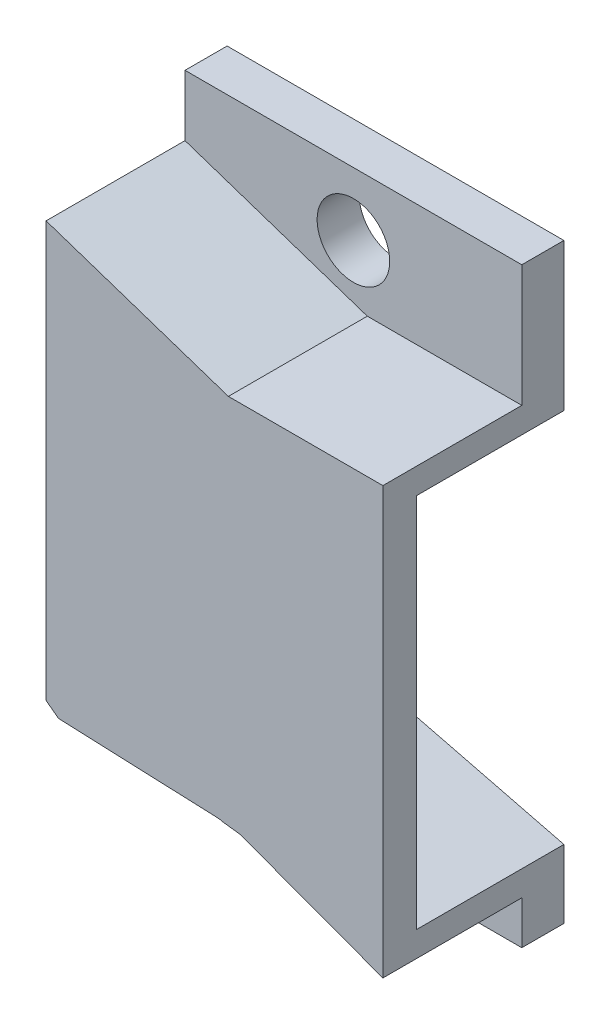
ISO-10303-21;
HEADER;
FILE_DESCRIPTION(('STEP AP214'),'2;1');
FILE_NAME('part.step','',(''),(''),'','','');
FILE_SCHEMA(('AUTOMOTIVE_DESIGN { 1 0 10303 214 1 1 1 1 }'));
ENDSEC;
DATA;
#1=APPLICATION_CONTEXT('core data for automotive mechanical design processes');
#2=APPLICATION_PROTOCOL_DEFINITION('international standard','automotive_design',2000,#1);
#3=PRODUCT_CONTEXT('',#1,'mechanical');
#4=PRODUCT('Part','Part','',(#3));
#5=PRODUCT_RELATED_PRODUCT_CATEGORY('part','',(#4));
#6=PRODUCT_DEFINITION_FORMATION('','',#4);
#7=PRODUCT_DEFINITION_CONTEXT('part definition',#1,'design');
#8=PRODUCT_DEFINITION('design','',#6,#7);
#9=PRODUCT_DEFINITION_SHAPE('','',#8);
#10=(LENGTH_UNIT() NAMED_UNIT(*) SI_UNIT(.MILLI.,.METRE.));
#11=(NAMED_UNIT(*) PLANE_ANGLE_UNIT() SI_UNIT($,.RADIAN.));
#12=(NAMED_UNIT(*) SI_UNIT($,.STERADIAN.) SOLID_ANGLE_UNIT());
#13=UNCERTAINTY_MEASURE_WITH_UNIT(LENGTH_MEASURE(1.E-05),#10,'distance_accuracy_value','');
#14=(GEOMETRIC_REPRESENTATION_CONTEXT(3) GLOBAL_UNCERTAINTY_ASSIGNED_CONTEXT((#13)) GLOBAL_UNIT_ASSIGNED_CONTEXT((#10,
#11,#12)) REPRESENTATION_CONTEXT('',''));
#15=CARTESIAN_POINT('',(0.,0.,0.));
#16=DIRECTION('',(0.,0.,1.));
#17=DIRECTION('',(1.,0.,0.));
#18=AXIS2_PLACEMENT_3D('',#15,#16,#17);
#19=CARTESIAN_POINT('',(0.,0.,0.));
#20=DIRECTION('',(0.,0.,1.));
#21=DIRECTION('',(1.,0.,0.));
#22=AXIS2_PLACEMENT_3D('',#19,#20,#21);
#23=PLANE('',#22);
#24=CARTESIAN_POINT('',(-5.44553876278845,10.9552932215466,0.));
#25=DIRECTION('',(0.,0.,1.));
#26=DIRECTION('',(1.,0.,0.));
#27=AXIS2_PLACEMENT_3D('',#24,#25,#26);
#28=CIRCLE('',#27,1.725);
#29=CARTESIAN_POINT('',(-7.17053876278845,10.9552932215466,0.));
#30=VERTEX_POINT('',#29);
#31=EDGE_CURVE('E279',#30,#30,#28,.T.);
#32=ORIENTED_EDGE('',*,*,#31,.T.);
#33=EDGE_LOOP('',(#32));
#34=FACE_BOUND('',#33,.T.);
#35=DIRECTION('',(1.,0.,0.));
#36=VECTOR('',#35,1.);
#37=CARTESIAN_POINT('',(2.55446123721155,6.95529322154655,0.));
#38=LINE('',#37,#36);
#39=CARTESIAN_POINT('',(-3.80839685580447,6.95529322154655,0.));
#40=VERTEX_POINT('',#39);
#41=CARTESIAN_POINT('',(2.55446123721155,6.95529322154655,0.));
#42=VERTEX_POINT('',#41);
#43=EDGE_CURVE('E261',#40,#42,#38,.T.);
#44=ORIENTED_EDGE('',*,*,#43,.F.);
#45=DIRECTION('',(0.956055091747042,-0.293187076018974,0.));
#46=VECTOR('',#45,1.);
#47=CARTESIAN_POINT('',(-13.4455387627885,9.91065163266638,0.));
#48=LINE('',#47,#46);
#49=CARTESIAN_POINT('',(-13.4455387627885,9.91065163266638,0.));
#50=VERTEX_POINT('',#49);
#51=EDGE_CURVE('E237',#50,#40,#48,.T.);
#52=ORIENTED_EDGE('',*,*,#51,.F.);
#53=DIRECTION('',(0.,-1.,0.));
#54=VECTOR('',#53,1.);
#55=CARTESIAN_POINT('',(-13.4455387627885,13.9552932215466,0.));
#56=LINE('',#55,#54);
#57=CARTESIAN_POINT('',(-13.4455387627885,13.9552932215466,0.));
#58=VERTEX_POINT('',#57);
#59=EDGE_CURVE('E292',#58,#50,#56,.T.);
#60=ORIENTED_EDGE('',*,*,#59,.F.);
#61=DIRECTION('',(-1.,0.,0.));
#62=VECTOR('',#61,1.);
#63=CARTESIAN_POINT('',(-13.4455387627885,13.9552932215466,0.));
#64=LINE('',#63,#62);
#65=CARTESIAN_POINT('',(2.55446123721155,13.9552932215466,0.));
#66=VERTEX_POINT('',#65);
#67=EDGE_CURVE('E288',#66,#58,#64,.T.);
#68=ORIENTED_EDGE('',*,*,#67,.F.);
#69=DIRECTION('',(0.,1.,0.));
#70=VECTOR('',#69,1.);
#71=CARTESIAN_POINT('',(2.55446123721155,13.9552932215466,0.));
#72=LINE('',#71,#70);
#73=EDGE_CURVE('E298',#42,#66,#72,.T.);
#74=ORIENTED_EDGE('',*,*,#73,.F.);
#75=EDGE_LOOP('',(#44,#52,#60,#68,#74));
#76=FACE_BOUND('',#75,.T.);
#77=ADVANCED_FACE('F37',(#34,#76),#23,.F.);
#78=CARTESIAN_POINT('',(0.,0.,8.6));
#79=DIRECTION('',(0.,0.,1.));
#80=DIRECTION('',(1.,0.,0.));
#81=AXIS2_PLACEMENT_3D('',#78,#79,#80);
#82=PLANE('',#81);
#83=DIRECTION('',(1.,0.,0.));
#84=VECTOR('',#83,1.);
#85=CARTESIAN_POINT('',(0.,8.16943935308956,8.6));
#86=LINE('',#85,#84);
#87=CARTESIAN_POINT('',(-4.78538363029912,8.16943935308956,8.6));
#88=VERTEX_POINT('',#87);
#89=CARTESIAN_POINT('',(2.55446123721155,8.16943935308956,8.6));
#90=VERTEX_POINT('',#89);
#91=EDGE_CURVE('E228',#88,#90,#86,.T.);
#92=ORIENTED_EDGE('',*,*,#91,.F.);
#93=DIRECTION('',(0.94847910825439,-0.316839677447375,0.));
#94=VECTOR('',#93,1.);
#95=CARTESIAN_POINT('',(1.97465359233253,5.91124727008966,8.6));
#96=LINE('',#95,#94);
#97=CARTESIAN_POINT('',(-13.4455387627885,11.0623662873181,8.6));
#98=VERTEX_POINT('',#97);
#99=EDGE_CURVE('E175',#98,#88,#96,.T.);
#100=ORIENTED_EDGE('',*,*,#99,.F.);
#101=DIRECTION('',(0.,-1.,0.));
#102=VECTOR('',#101,1.);
#103=CARTESIAN_POINT('',(-13.4455387627885,13.9552932215466,8.6));
#104=LINE('',#103,#102);
#105=CARTESIAN_POINT('',(-13.4455387627885,-8.67337257647297,8.6));
#106=VERTEX_POINT('',#105);
#107=EDGE_CURVE('E285',#98,#106,#104,.T.);
#108=ORIENTED_EDGE('',*,*,#107,.T.);
#109=DIRECTION('',(-0.799778153930478,0.600295680890306,0.));
#110=VECTOR('',#109,1.);
#111=CARTESIAN_POINT('',(-9.00928125277845,-12.0031287213347,8.6));
#112=LINE('',#111,#110);
#113=CARTESIAN_POINT('',(-12.8545261157629,-9.11697351457993,8.6));
#114=VERTEX_POINT('',#113);
#115=EDGE_CURVE('E254',#114,#106,#112,.T.);
#116=ORIENTED_EDGE('',*,*,#115,.F.);
#117=DIRECTION('',(-0.999166262782959,0.0408262086941141,0.));
#118=VECTOR('',#117,1.);
#119=CARTESIAN_POINT('',(-0.393326795066381,-9.62614155096731,8.6));
#120=LINE('',#119,#118);
#121=CARTESIAN_POINT('',(-5.44553876278844,-9.41970677845345,8.6));
#122=VERTEX_POINT('',#121);
#123=EDGE_CURVE('E200',#122,#114,#120,.T.);
#124=ORIENTED_EDGE('',*,*,#123,.F.);
#125=CARTESIAN_POINT('',(-5.44553876278845,-11.1447067784534,8.6));
#126=DIRECTION('',(0.,0.,1.));
#127=DIRECTION('',(1.,0.,0.));
#128=AXIS2_PLACEMENT_3D('',#125,#126,#127);
#129=CIRCLE('',#128,1.725);
#130=CARTESIAN_POINT('',(-5.02036474186596,-9.47292567677399,8.6));
#131=VERTEX_POINT('',#130);
#132=EDGE_CURVE('E276',#131,#122,#129,.T.);
#133=ORIENTED_EDGE('',*,*,#132,.F.);
#134=DIRECTION('',(-0.992257140246851,0.124200513803857,0.));
#135=VECTOR('',#134,1.);
#136=CARTESIAN_POINT('',(-1.24487541467346,-9.94550248703673,8.6));
#137=LINE('',#136,#135);
#138=CARTESIAN_POINT('',(-4.23378555348108,-9.57138154610693,8.6));
#139=VERTEX_POINT('',#138);
#140=EDGE_CURVE('E223',#139,#131,#137,.T.);
#141=ORIENTED_EDGE('',*,*,#140,.F.);
#142=DIRECTION('',(-0.937555253608168,0.3478363788216,0.));
#143=VECTOR('',#142,1.);
#144=CARTESIAN_POINT('',(-3.63362531725117,-9.79404315722748,8.6));
#145=LINE('',#144,#143);
#146=CARTESIAN_POINT('',(2.55446123721155,-12.0898455759706,8.6));
#147=VERTEX_POINT('',#146);
#148=EDGE_CURVE('E226',#147,#139,#145,.T.);
#149=ORIENTED_EDGE('',*,*,#148,.F.);
#150=DIRECTION('',(0.,1.,0.));
#151=VECTOR('',#150,1.);
#152=CARTESIAN_POINT('',(2.55446123721155,13.9552932215466,8.6));
#153=LINE('',#152,#151);
#154=EDGE_CURVE('E287',#147,#90,#153,.T.);
#155=ORIENTED_EDGE('',*,*,#154,.T.);
#156=EDGE_LOOP('',(#92,#100,#108,#116,#124,#133,#141,#149,#155));
#157=FACE_BOUND('',#156,.T.);
#158=ADVANCED_FACE('F328',(#157),#82,.T.);
#159=DIRECTION('',(-1.,0.,0.));
#160=VECTOR('',#159,1.);
#161=CARTESIAN_POINT('',(2.55446123721155,-7.64470677845345,0.));
#162=LINE('',#161,#160);
#163=CARTESIAN_POINT('',(-10.4455387627885,-7.64470677845345,0.));
#164=VERTEX_POINT('',#163);
#165=CARTESIAN_POINT('',(-13.4455387627885,-7.64470677845345,0.));
#166=VERTEX_POINT('',#165);
#167=EDGE_CURVE('E257',#164,#166,#162,.T.);
#168=ORIENTED_EDGE('',*,*,#167,.F.);
#169=DIRECTION('',(-0.970142500145332,0.242535625036333,0.));
#170=VECTOR('',#169,1.);
#171=CARTESIAN_POINT('',(2.55446123721155,-10.8947067784534,0.));
#172=LINE('',#171,#170);
#173=CARTESIAN_POINT('',(2.55446123721155,-10.8947067784534,0.));
#174=VERTEX_POINT('',#173);
#175=EDGE_CURVE('E235',#174,#164,#172,.T.);
#176=ORIENTED_EDGE('',*,*,#175,.F.);
#177=CARTESIAN_POINT('',(2.55446123721155,-14.1447067784534,0.));
#178=VERTEX_POINT('',#177);
#179=EDGE_CURVE('E299',#178,#174,#72,.T.);
#180=ORIENTED_EDGE('',*,*,#179,.F.);
#181=DIRECTION('',(1.,0.,0.));
#182=VECTOR('',#181,1.);
#183=CARTESIAN_POINT('',(-13.4455387627885,-14.1447067784534,0.));
#184=LINE('',#183,#182);
#185=CARTESIAN_POINT('',(-6.15604175840098,-14.1447067784534,0.));
#186=VERTEX_POINT('',#185);
#187=EDGE_CURVE('E295',#186,#178,#184,.T.);
#188=ORIENTED_EDGE('',*,*,#187,.F.);
#189=DIRECTION('',(0.799778153930478,-0.600295680890306,0.));
#190=VECTOR('',#189,1.);
#191=CARTESIAN_POINT('',(-13.4455387627885,-8.67337257647297,0.));
#192=LINE('',#191,#190);
#193=CARTESIAN_POINT('',(-13.4455387627885,-8.67337257647297,0.));
#194=VERTEX_POINT('',#193);
#195=EDGE_CURVE('E241',#194,#186,#192,.T.);
#196=ORIENTED_EDGE('',*,*,#195,.F.);
#197=EDGE_CURVE('E284',#166,#194,#56,.T.);
#198=ORIENTED_EDGE('',*,*,#197,.F.);
#199=EDGE_LOOP('',(#168,#176,#180,#188,#196,#198));
#200=FACE_BOUND('',#199,.T.);
#201=CARTESIAN_POINT('',(-5.44553876278845,-11.1447067784534,0.));
#202=DIRECTION('',(0.,0.,1.));
#203=DIRECTION('',(1.,0.,0.));
#204=AXIS2_PLACEMENT_3D('',#201,#202,#203);
#205=CIRCLE('',#204,1.725);
#206=CARTESIAN_POINT('',(-3.72053876278845,-11.1447067784534,0.));
#207=VERTEX_POINT('',#206);
#208=EDGE_CURVE('E273',#207,#207,#205,.T.);
#209=ORIENTED_EDGE('',*,*,#208,.T.);
#210=EDGE_LOOP('',(#209));
#211=FACE_BOUND('',#210,.T.);
#212=ADVANCED_FACE('F330',(#200,#211),#23,.F.);
#213=CARTESIAN_POINT('',(-13.4455387627885,13.9552932215466,8.6));
#214=DIRECTION('',(1.,0.,0.));
#215=DIRECTION('',(0.,1.,0.));
#216=AXIS2_PLACEMENT_3D('',#213,#214,#215);
#217=PLANE('',#216);
#218=ORIENTED_EDGE('',*,*,#107,.F.);
#219=DIRECTION('',(0.,0.,-1.));
#220=VECTOR('',#219,1.);
#221=CARTESIAN_POINT('',(-13.4455387627885,11.0623662873181,20.));
#222=LINE('',#221,#220);
#223=CARTESIAN_POINT('',(-13.4455387627885,11.0623662873181,2.));
#224=VERTEX_POINT('',#223);
#225=EDGE_CURVE('E179',#98,#224,#222,.T.);
#226=ORIENTED_EDGE('',*,*,#225,.T.);
#227=DIRECTION('',(0.,-1.,0.));
#228=VECTOR('',#227,1.);
#229=CARTESIAN_POINT('',(-13.4455387627885,0.,2.));
#230=LINE('',#229,#228);
#231=CARTESIAN_POINT('',(-13.4455387627885,13.9552932215466,2.));
#232=VERTEX_POINT('',#231);
#233=EDGE_CURVE('E184',#232,#224,#230,.T.);
#234=ORIENTED_EDGE('',*,*,#233,.F.);
#235=DIRECTION('',(0.,0.,-1.));
#236=VECTOR('',#235,1.);
#237=CARTESIAN_POINT('',(-13.4455387627885,13.9552932215466,8.6));
#238=LINE('',#237,#236);
#239=EDGE_CURVE('E291',#232,#58,#238,.T.);
#240=ORIENTED_EDGE('',*,*,#239,.T.);
#241=ORIENTED_EDGE('',*,*,#59,.T.);
#242=DIRECTION('',(0.,0.,-1.));
#243=VECTOR('',#242,1.);
#244=CARTESIAN_POINT('',(-13.4455387627885,9.91065163266638,7.));
#245=LINE('',#244,#243);
#246=CARTESIAN_POINT('',(-13.4455387627885,9.91065163266638,7.));
#247=VERTEX_POINT('',#246);
#248=EDGE_CURVE('E243',#247,#50,#245,.T.);
#249=ORIENTED_EDGE('',*,*,#248,.F.);
#250=DIRECTION('',(0.,1.,0.));
#251=VECTOR('',#250,1.);
#252=CARTESIAN_POINT('',(-13.4455387627885,6.95529322154655,7.));
#253=LINE('',#252,#251);
#254=CARTESIAN_POINT('',(-13.4455387627885,-7.64470677845345,7.));
#255=VERTEX_POINT('',#254);
#256=EDGE_CURVE('E263',#255,#247,#253,.T.);
#257=ORIENTED_EDGE('',*,*,#256,.F.);
#258=DIRECTION('',(0.,0.,-1.));
#259=VECTOR('',#258,1.);
#260=CARTESIAN_POINT('',(-13.4455387627885,-7.64470677845345,7.));
#261=LINE('',#260,#259);
#262=EDGE_CURVE('E267',#255,#166,#261,.T.);
#263=ORIENTED_EDGE('',*,*,#262,.T.);
#264=ORIENTED_EDGE('',*,*,#197,.T.);
#265=DIRECTION('',(0.,0.,-1.));
#266=VECTOR('',#265,1.);
#267=CARTESIAN_POINT('',(-13.4455387627885,-8.67337257647297,16.));
#268=LINE('',#267,#266);
#269=EDGE_CURVE('E252',#106,#194,#268,.T.);
#270=ORIENTED_EDGE('',*,*,#269,.F.);
#271=EDGE_LOOP('',(#218,#226,#234,#240,#241,#249,#257,#263,#264,#270));
#272=FACE_BOUND('',#271,.T.);
#273=ADVANCED_FACE('F39',(#272),#217,.F.);
#274=CARTESIAN_POINT('',(-13.4455387627885,-14.1447067784534,8.6));
#275=DIRECTION('',(0.,1.,0.));
#276=DIRECTION('',(0.,0.,1.));
#277=AXIS2_PLACEMENT_3D('',#274,#275,#276);
#278=PLANE('',#277);
#279=DIRECTION('',(0.,0.,-1.));
#280=VECTOR('',#279,1.);
#281=CARTESIAN_POINT('',(2.55446123721155,-14.1447067784534,8.6));
#282=LINE('',#281,#280);
#283=CARTESIAN_POINT('',(2.55446123721155,-14.1447067784534,2.));
#284=VERTEX_POINT('',#283);
#285=EDGE_CURVE('E307',#284,#178,#282,.T.);
#286=ORIENTED_EDGE('',*,*,#285,.F.);
#287=DIRECTION('',(-1.,0.,0.));
#288=VECTOR('',#287,1.);
#289=CARTESIAN_POINT('',(0.,-14.1447067784534,2.));
#290=LINE('',#289,#288);
#291=CARTESIAN_POINT('',(-6.15604175840098,-14.1447067784534,2.));
#292=VERTEX_POINT('',#291);
#293=EDGE_CURVE('E211',#284,#292,#290,.T.);
#294=ORIENTED_EDGE('',*,*,#293,.T.);
#295=DIRECTION('',(0.,0.,-1.));
#296=VECTOR('',#295,1.);
#297=CARTESIAN_POINT('',(-6.15604175840098,-14.1447067784534,8.6));
#298=LINE('',#297,#296);
#299=EDGE_CURVE('E309',#292,#186,#298,.T.);
#300=ORIENTED_EDGE('',*,*,#299,.T.);
#301=ORIENTED_EDGE('',*,*,#187,.T.);
#302=EDGE_LOOP('',(#286,#294,#300,#301));
#303=FACE_BOUND('',#302,.T.);
#304=ADVANCED_FACE('F401',(#303),#278,.F.);
#305=CARTESIAN_POINT('',(2.55446123721155,13.9552932215466,8.6));
#306=DIRECTION('',(-1.,0.,0.));
#307=DIRECTION('',(0.,-1.,0.));
#308=AXIS2_PLACEMENT_3D('',#305,#306,#307);
#309=PLANE('',#308);
#310=DIRECTION('',(0.,1.,0.));
#311=VECTOR('',#310,1.);
#312=CARTESIAN_POINT('',(2.55446123721155,0.,2.));
#313=LINE('',#312,#311);
#314=CARTESIAN_POINT('',(2.55446123721155,8.16943935308956,2.));
#315=VERTEX_POINT('',#314);
#316=CARTESIAN_POINT('',(2.55446123721155,13.9552932215466,2.));
#317=VERTEX_POINT('',#316);
#318=EDGE_CURVE('E52',#315,#317,#313,.T.);
#319=ORIENTED_EDGE('',*,*,#318,.F.);
#320=DIRECTION('',(0.,0.,-1.));
#321=VECTOR('',#320,1.);
#322=CARTESIAN_POINT('',(2.55446123721155,8.16943935308956,20.));
#323=LINE('',#322,#321);
#324=EDGE_CURVE('E188',#90,#315,#323,.T.);
#325=ORIENTED_EDGE('',*,*,#324,.F.);
#326=ORIENTED_EDGE('',*,*,#154,.F.);
#327=DIRECTION('',(0.,0.,-1.));
#328=VECTOR('',#327,1.);
#329=CARTESIAN_POINT('',(2.55446123721155,-12.0898455759706,8.6));
#330=LINE('',#329,#328);
#331=CARTESIAN_POINT('',(2.55446123721155,-12.0898455759706,2.));
#332=VERTEX_POINT('',#331);
#333=EDGE_CURVE('E11',#147,#332,#330,.T.);
#334=ORIENTED_EDGE('',*,*,#333,.T.);
#335=DIRECTION('',(0.,-1.,0.));
#336=VECTOR('',#335,1.);
#337=CARTESIAN_POINT('',(2.55446123721155,0.,2.));
#338=LINE('',#337,#336);
#339=EDGE_CURVE('E208',#332,#284,#338,.T.);
#340=ORIENTED_EDGE('',*,*,#339,.T.);
#341=ORIENTED_EDGE('',*,*,#285,.T.);
#342=ORIENTED_EDGE('',*,*,#179,.T.);
#343=DIRECTION('',(0.,0.,-1.));
#344=VECTOR('',#343,1.);
#345=CARTESIAN_POINT('',(2.55446123721155,-10.8947067784534,7.));
#346=LINE('',#345,#344);
#347=CARTESIAN_POINT('',(2.55446123721155,-10.8947067784534,7.));
#348=VERTEX_POINT('',#347);
#349=EDGE_CURVE('E234',#348,#174,#346,.T.);
#350=ORIENTED_EDGE('',*,*,#349,.F.);
#351=DIRECTION('',(0.,-1.,0.));
#352=VECTOR('',#351,1.);
#353=CARTESIAN_POINT('',(2.55446123721155,6.95529322154655,7.));
#354=LINE('',#353,#352);
#355=CARTESIAN_POINT('',(2.55446123721155,6.95529322154655,7.));
#356=VERTEX_POINT('',#355);
#357=EDGE_CURVE('E258',#356,#348,#354,.T.);
#358=ORIENTED_EDGE('',*,*,#357,.F.);
#359=DIRECTION('',(0.,0.,-1.));
#360=VECTOR('',#359,1.);
#361=CARTESIAN_POINT('',(2.55446123721155,6.95529322154655,7.));
#362=LINE('',#361,#360);
#363=EDGE_CURVE('E270',#356,#42,#362,.T.);
#364=ORIENTED_EDGE('',*,*,#363,.T.);
#365=ORIENTED_EDGE('',*,*,#73,.T.);
#366=DIRECTION('',(0.,0.,-1.));
#367=VECTOR('',#366,1.);
#368=CARTESIAN_POINT('',(2.55446123721155,13.9552932215466,8.6));
#369=LINE('',#368,#367);
#370=EDGE_CURVE('E305',#317,#66,#369,.T.);
#371=ORIENTED_EDGE('',*,*,#370,.F.);
#372=EDGE_LOOP('',(#319,#325,#326,#334,#340,#341,#342,#350,#358,#364,#365,#371));
#373=FACE_BOUND('',#372,.T.);
#374=ADVANCED_FACE('F344',(#373),#309,.F.);
#375=CARTESIAN_POINT('',(-13.4455387627885,13.9552932215466,8.6));
#376=DIRECTION('',(0.,-1.,0.));
#377=DIRECTION('',(0.,0.,-1.));
#378=AXIS2_PLACEMENT_3D('',#375,#376,#377);
#379=PLANE('',#378);
#380=ORIENTED_EDGE('',*,*,#239,.F.);
#381=DIRECTION('',(-1.,0.,0.));
#382=VECTOR('',#381,1.);
#383=CARTESIAN_POINT('',(0.,13.9552932215466,2.));
#384=LINE('',#383,#382);
#385=EDGE_CURVE('E196',#317,#232,#384,.T.);
#386=ORIENTED_EDGE('',*,*,#385,.F.);
#387=ORIENTED_EDGE('',*,*,#370,.T.);
#388=ORIENTED_EDGE('',*,*,#67,.T.);
#389=EDGE_LOOP('',(#380,#386,#387,#388));
#390=FACE_BOUND('',#389,.T.);
#391=ADVANCED_FACE('F322',(#390),#379,.F.);
#392=CARTESIAN_POINT('',(-5.44553876278845,10.9552932215466,8.6));
#393=DIRECTION('',(0.,0.,-1.));
#394=DIRECTION('',(-1.,0.,0.));
#395=AXIS2_PLACEMENT_3D('',#392,#393,#394);
#396=CYLINDRICAL_SURFACE('',#395,1.725);
#397=CARTESIAN_POINT('',(-5.44553876278845,10.9552932215466,2.));
#398=DIRECTION('',(0.,0.,-1.));
#399=DIRECTION('',(-1.,0.,0.));
#400=AXIS2_PLACEMENT_3D('',#397,#398,#399);
#401=CIRCLE('',#400,1.725);
#402=CARTESIAN_POINT('',(-7.17053876278845,10.9552932215466,2.));
#403=VERTEX_POINT('',#402);
#404=EDGE_CURVE('E225',#403,#403,#401,.T.);
#405=CARTESIAN_POINT('',(-7.17053876278845,10.9552932215466,2.));
#406=CARTESIAN_POINT('',(-7.17053876278845,10.9552932215466,1.97916666666667));
#407=CARTESIAN_POINT('',(-7.17053876278845,10.9552932215466,1.95833333333333));
#408=CARTESIAN_POINT('',(-7.17053876278845,10.9552932215466,1.91666666666667));
#409=CARTESIAN_POINT('',(-7.17053876278845,10.9552932215466,1.89583333333333));
#410=CARTESIAN_POINT('',(-7.17053876278845,10.9552932215466,1.85416666666667));
#411=CARTESIAN_POINT('',(-7.17053876278845,10.9552932215466,1.83333333333333));
#412=CARTESIAN_POINT('',(-7.17053876278845,10.9552932215466,1.79166666666667));
#413=CARTESIAN_POINT('',(-7.17053876278845,10.9552932215466,1.77083333333333));
#414=CARTESIAN_POINT('',(-7.17053876278845,10.9552932215466,1.72916666666667));
#415=CARTESIAN_POINT('',(-7.17053876278845,10.9552932215466,1.70833333333333));
#416=CARTESIAN_POINT('',(-7.17053876278845,10.9552932215466,1.66666666666667));
#417=CARTESIAN_POINT('',(-7.17053876278845,10.9552932215466,1.64583333333333));
#418=CARTESIAN_POINT('',(-7.17053876278845,10.9552932215466,1.60416666666667));
#419=CARTESIAN_POINT('',(-7.17053876278845,10.9552932215466,1.58333333333333));
#420=CARTESIAN_POINT('',(-7.17053876278845,10.9552932215466,1.54166666666667));
#421=CARTESIAN_POINT('',(-7.17053876278845,10.9552932215466,1.52083333333333));
#422=CARTESIAN_POINT('',(-7.17053876278845,10.9552932215466,1.47916666666667));
#423=CARTESIAN_POINT('',(-7.17053876278845,10.9552932215466,1.45833333333333));
#424=CARTESIAN_POINT('',(-7.17053876278845,10.9552932215466,1.41666666666667));
#425=CARTESIAN_POINT('',(-7.17053876278845,10.9552932215466,1.39583333333333));
#426=CARTESIAN_POINT('',(-7.17053876278845,10.9552932215466,1.35416666666667));
#427=CARTESIAN_POINT('',(-7.17053876278845,10.9552932215466,1.33333333333333));
#428=CARTESIAN_POINT('',(-7.17053876278845,10.9552932215466,1.29166666666667));
#429=CARTESIAN_POINT('',(-7.17053876278845,10.9552932215466,1.27083333333333));
#430=CARTESIAN_POINT('',(-7.17053876278845,10.9552932215466,1.22916666666667));
#431=CARTESIAN_POINT('',(-7.17053876278845,10.9552932215466,1.20833333333333));
#432=CARTESIAN_POINT('',(-7.17053876278845,10.9552932215466,1.16666666666667));
#433=CARTESIAN_POINT('',(-7.17053876278845,10.9552932215466,1.14583333333333));
#434=CARTESIAN_POINT('',(-7.17053876278845,10.9552932215466,1.10416666666667));
#435=CARTESIAN_POINT('',(-7.17053876278845,10.9552932215466,1.08333333333333));
#436=CARTESIAN_POINT('',(-7.17053876278845,10.9552932215466,1.04166666666667));
#437=CARTESIAN_POINT('',(-7.17053876278845,10.9552932215466,1.02083333333333));
#438=CARTESIAN_POINT('',(-7.17053876278845,10.9552932215466,0.979166666666666));
#439=CARTESIAN_POINT('',(-7.17053876278845,10.9552932215466,0.958333333333332));
#440=CARTESIAN_POINT('',(-7.17053876278845,10.9552932215466,0.916666666666666));
#441=CARTESIAN_POINT('',(-7.17053876278845,10.9552932215466,0.895833333333332));
#442=CARTESIAN_POINT('',(-7.17053876278845,10.9552932215466,0.854166666666666));
#443=CARTESIAN_POINT('',(-7.17053876278845,10.9552932215466,0.833333333333332));
#444=CARTESIAN_POINT('',(-7.17053876278845,10.9552932215466,0.791666666666666));
#445=CARTESIAN_POINT('',(-7.17053876278845,10.9552932215466,0.770833333333332));
#446=CARTESIAN_POINT('',(-7.17053876278845,10.9552932215466,0.729166666666666));
#447=CARTESIAN_POINT('',(-7.17053876278845,10.9552932215466,0.708333333333332));
#448=CARTESIAN_POINT('',(-7.17053876278845,10.9552932215466,0.666666666666666));
#449=CARTESIAN_POINT('',(-7.17053876278845,10.9552932215466,0.645833333333332));
#450=CARTESIAN_POINT('',(-7.17053876278845,10.9552932215466,0.604166666666666));
#451=CARTESIAN_POINT('',(-7.17053876278845,10.9552932215466,0.583333333333332));
#452=CARTESIAN_POINT('',(-7.17053876278845,10.9552932215466,0.541666666666665));
#453=CARTESIAN_POINT('',(-7.17053876278845,10.9552932215466,0.520833333333332));
#454=CARTESIAN_POINT('',(-7.17053876278845,10.9552932215466,0.479166666666665));
#455=CARTESIAN_POINT('',(-7.17053876278845,10.9552932215466,0.458333333333332));
#456=CARTESIAN_POINT('',(-7.17053876278845,10.9552932215466,0.416666666666665));
#457=CARTESIAN_POINT('',(-7.17053876278845,10.9552932215466,0.395833333333332));
#458=CARTESIAN_POINT('',(-7.17053876278845,10.9552932215466,0.354166666666665));
#459=CARTESIAN_POINT('',(-7.17053876278845,10.9552932215466,0.333333333333332));
#460=CARTESIAN_POINT('',(-7.17053876278845,10.9552932215466,0.291666666666665));
#461=CARTESIAN_POINT('',(-7.17053876278845,10.9552932215466,0.270833333333332));
#462=CARTESIAN_POINT('',(-7.17053876278845,10.9552932215466,0.229166666666665));
#463=CARTESIAN_POINT('',(-7.17053876278845,10.9552932215466,0.208333333333332));
#464=CARTESIAN_POINT('',(-7.17053876278845,10.9552932215466,0.166666666666665));
#465=CARTESIAN_POINT('',(-7.17053876278845,10.9552932215466,0.145833333333332));
#466=CARTESIAN_POINT('',(-7.17053876278845,10.9552932215466,0.104166666666665));
#467=CARTESIAN_POINT('',(-7.17053876278845,10.9552932215466,0.0833333333333317));
#468=CARTESIAN_POINT('',(-7.17053876278845,10.9552932215466,0.041666666666665));
#469=CARTESIAN_POINT('',(-7.17053876278845,10.9552932215466,0.0208333333333316));
#470=CARTESIAN_POINT('',(-7.17053876278845,10.9552932215466,0.));
#471=B_SPLINE_CURVE_WITH_KNOTS('',3,(#405,#406,#407,#408,#409,#410,#411,#412,#413,#414,#415,
#416,#417,#418,#419,#420,#421,#422,#423,#424,#425,#426,#427,#428,#429,#430,#431,#432,#433,#434,
#435,#436,#437,#438,#439,#440,#441,#442,#443,#444,#445,#446,#447,#448,#449,#450,#451,#452,#453,
#454,#455,#456,#457,#458,#459,#460,#461,#462,#463,#464,#465,#466,#467,#468,#469,#470),
.UNSPECIFIED.,.F.,.F.,(4,2,2,2,2,2,2,2,2,2,2,2,2,2,2,2,2,2,2,2,2,2,2,2,2,2,2,2,2,2,2,2,4),(0.,
0.0625000000000001,0.125,0.1875,0.25,0.3125,0.375,0.4375,0.5,0.5625,0.625000000000001,
0.687500000000001,0.750000000000002,0.812500000000002,0.875000000000002,0.937500000000002,1.,
1.0625,1.125,1.1875,1.25,1.3125,1.375,1.4375,1.5,1.5625,1.625,1.6875,1.75,1.8125,1.875,1.9375,
2.),.UNSPECIFIED.);
#472=EDGE_CURVE('BSEAM318',#403,#30,#471,.T.);
#473=ORIENTED_EDGE('',*,*,#404,.F.);
#474=ORIENTED_EDGE('',*,*,#31,.F.);
#475=ORIENTED_EDGE('',*,*,#472,.T.);
#476=ORIENTED_EDGE('',*,*,#472,.F.);
#477=EDGE_LOOP('',(#473,#475,#474,#476));
#478=FACE_BOUND('',#477,.T.);
#479=ADVANCED_FACE('F318',(#478),#396,.F.);
#480=CARTESIAN_POINT('',(-5.44553876278845,-11.1447067784534,8.6));
#481=DIRECTION('',(0.,0.,-1.));
#482=DIRECTION('',(-1.,0.,0.));
#483=AXIS2_PLACEMENT_3D('',#480,#481,#482);
#484=CYLINDRICAL_SURFACE('',#483,1.725);
#485=DIRECTION('',(0.,0.,-1.));
#486=VECTOR('',#485,1.);
#487=CARTESIAN_POINT('',(-5.02036474186595,-9.47292567677399,8.6));
#488=LINE('',#487,#486);
#489=CARTESIAN_POINT('',(-5.02036474186596,-9.47292567677399,2.));
#490=VERTEX_POINT('',#489);
#491=EDGE_CURVE('E45',#131,#490,#488,.T.);
#492=ORIENTED_EDGE('',*,*,#491,.F.);
#493=ORIENTED_EDGE('',*,*,#132,.T.);
#494=DIRECTION('',(0.,0.,-1.));
#495=VECTOR('',#494,1.);
#496=CARTESIAN_POINT('',(-5.44553876278844,-9.41970677845345,20.));
#497=LINE('',#496,#495);
#498=CARTESIAN_POINT('',(-5.44553876278844,-9.41970677845345,2.));
#499=VERTEX_POINT('',#498);
#500=EDGE_CURVE('E189',#122,#499,#497,.T.);
#501=ORIENTED_EDGE('',*,*,#500,.T.);
#502=CARTESIAN_POINT('',(-5.44553876278845,-11.1447067784534,2.));
#503=DIRECTION('',(0.,0.,-1.));
#504=DIRECTION('',(-1.,0.,0.));
#505=AXIS2_PLACEMENT_3D('',#502,#503,#504);
#506=CIRCLE('',#505,1.725);
#507=EDGE_CURVE('E218',#499,#490,#506,.F.);
#508=ORIENTED_EDGE('',*,*,#507,.T.);
#509=EDGE_LOOP('',(#492,#493,#501,#508));
#510=FACE_BOUND('',#509,.T.);
#511=ORIENTED_EDGE('',*,*,#208,.F.);
#512=EDGE_LOOP('',(#511));
#513=FACE_BOUND('',#512,.T.);
#514=ADVANCED_FACE('F321',(#510,#513),#484,.F.);
#515=CARTESIAN_POINT('',(2.55446123721155,6.95529322154655,7.));
#516=DIRECTION('',(0.,1.,0.));
#517=DIRECTION('',(0.,0.,1.));
#518=AXIS2_PLACEMENT_3D('',#515,#516,#517);
#519=PLANE('',#518);
#520=DIRECTION('',(1.,0.,0.));
#521=VECTOR('',#520,1.);
#522=CARTESIAN_POINT('',(2.55446123721155,6.95529322154655,7.));
#523=LINE('',#522,#521);
#524=CARTESIAN_POINT('',(-3.80839685580447,6.95529322154655,7.));
#525=VERTEX_POINT('',#524);
#526=EDGE_CURVE('E265',#525,#356,#523,.T.);
#527=ORIENTED_EDGE('',*,*,#526,.F.);
#528=DIRECTION('',(0.,0.,-1.));
#529=VECTOR('',#528,1.);
#530=CARTESIAN_POINT('',(-3.80839685580447,6.95529322154655,7.));
#531=LINE('',#530,#529);
#532=EDGE_CURVE('E231',#525,#40,#531,.T.);
#533=ORIENTED_EDGE('',*,*,#532,.T.);
#534=ORIENTED_EDGE('',*,*,#43,.T.);
#535=ORIENTED_EDGE('',*,*,#363,.F.);
#536=EDGE_LOOP('',(#527,#533,#534,#535));
#537=FACE_BOUND('',#536,.T.);
#538=ADVANCED_FACE('F340',(#537),#519,.F.);
#539=CARTESIAN_POINT('',(2.55446123721155,-7.64470677845345,7.));
#540=DIRECTION('',(0.,-1.,0.));
#541=DIRECTION('',(0.,0.,-1.));
#542=AXIS2_PLACEMENT_3D('',#539,#540,#541);
#543=PLANE('',#542);
#544=DIRECTION('',(-1.,0.,0.));
#545=VECTOR('',#544,1.);
#546=CARTESIAN_POINT('',(2.55446123721155,-7.64470677845345,7.));
#547=LINE('',#546,#545);
#548=CARTESIAN_POINT('',(-10.4455387627885,-7.64470677845345,7.));
#549=VERTEX_POINT('',#548);
#550=EDGE_CURVE('E260',#549,#255,#547,.T.);
#551=ORIENTED_EDGE('',*,*,#550,.F.);
#552=DIRECTION('',(0.,0.,-1.));
#553=VECTOR('',#552,1.);
#554=CARTESIAN_POINT('',(-10.4455387627885,-7.64470677845345,7.));
#555=LINE('',#554,#553);
#556=EDGE_CURVE('E238',#549,#164,#555,.T.);
#557=ORIENTED_EDGE('',*,*,#556,.T.);
#558=ORIENTED_EDGE('',*,*,#167,.T.);
#559=ORIENTED_EDGE('',*,*,#262,.F.);
#560=EDGE_LOOP('',(#551,#557,#558,#559));
#561=FACE_BOUND('',#560,.T.);
#562=ADVANCED_FACE('F358',(#561),#543,.F.);
#563=CARTESIAN_POINT('',(0.,0.,7.));
#564=DIRECTION('',(0.,0.,-1.));
#565=DIRECTION('',(-1.,0.,0.));
#566=AXIS2_PLACEMENT_3D('',#563,#564,#565);
#567=PLANE('',#566);
#568=ORIENTED_EDGE('',*,*,#357,.T.);
#569=DIRECTION('',(-0.970142500145332,0.242535625036333,0.));
#570=VECTOR('',#569,1.);
#571=CARTESIAN_POINT('',(2.55446123721155,-10.8947067784534,7.));
#572=LINE('',#571,#570);
#573=EDGE_CURVE('E232',#348,#549,#572,.T.);
#574=ORIENTED_EDGE('',*,*,#573,.T.);
#575=ORIENTED_EDGE('',*,*,#550,.T.);
#576=ORIENTED_EDGE('',*,*,#256,.T.);
#577=DIRECTION('',(0.956055091747042,-0.293187076018974,0.));
#578=VECTOR('',#577,1.);
#579=CARTESIAN_POINT('',(-13.4455387627885,9.91065163266638,7.));
#580=LINE('',#579,#578);
#581=EDGE_CURVE('E245',#247,#525,#580,.T.);
#582=ORIENTED_EDGE('',*,*,#581,.T.);
#583=ORIENTED_EDGE('',*,*,#526,.T.);
#584=EDGE_LOOP('',(#568,#574,#575,#576,#582,#583));
#585=FACE_BOUND('',#584,.T.);
#586=ADVANCED_FACE('F349',(#585),#567,.T.);
#587=CARTESIAN_POINT('',(-13.4455387627885,-8.67337257647297,16.));
#588=DIRECTION('',(0.600295680890306,0.799778153930478,0.));
#589=DIRECTION('',(-0.799778153930478,0.600295680890306,0.));
#590=AXIS2_PLACEMENT_3D('',#587,#588,#589);
#591=PLANE('',#590);
#592=DIRECTION('',(-0.799778153930478,0.600295680890306,0.));
#593=VECTOR('',#592,1.);
#594=CARTESIAN_POINT('',(-9.00928125277845,-12.0031287213347,2.));
#595=LINE('',#594,#593);
#596=CARTESIAN_POINT('',(-12.8545261157629,-9.11697351457993,2.));
#597=VERTEX_POINT('',#596);
#598=EDGE_CURVE('E214',#292,#597,#595,.T.);
#599=ORIENTED_EDGE('',*,*,#598,.T.);
#600=DIRECTION('',(0.,0.,1.));
#601=VECTOR('',#600,1.);
#602=CARTESIAN_POINT('',(-12.8545261157629,-9.11697351457993,16.));
#603=LINE('',#602,#601);
#604=EDGE_CURVE('E311',#597,#114,#603,.T.);
#605=ORIENTED_EDGE('',*,*,#604,.T.);
#606=ORIENTED_EDGE('',*,*,#115,.T.);
#607=ORIENTED_EDGE('',*,*,#269,.T.);
#608=ORIENTED_EDGE('',*,*,#195,.T.);
#609=ORIENTED_EDGE('',*,*,#299,.F.);
#610=EDGE_LOOP('',(#599,#605,#606,#607,#608,#609));
#611=FACE_BOUND('',#610,.T.);
#612=ADVANCED_FACE('F390',(#611),#591,.F.);
#613=CARTESIAN_POINT('',(-13.4455387627885,9.91065163266638,7.));
#614=DIRECTION('',(0.293187076018974,0.956055091747042,0.));
#615=DIRECTION('',(-0.956055091747042,0.293187076018974,0.));
#616=AXIS2_PLACEMENT_3D('',#613,#614,#615);
#617=PLANE('',#616);
#618=ORIENTED_EDGE('',*,*,#51,.T.);
#619=ORIENTED_EDGE('',*,*,#532,.F.);
#620=ORIENTED_EDGE('',*,*,#581,.F.);
#621=ORIENTED_EDGE('',*,*,#248,.T.);
#622=EDGE_LOOP('',(#618,#619,#620,#621));
#623=FACE_BOUND('',#622,.T.);
#624=ADVANCED_FACE('F364',(#623),#617,.F.);
#625=CARTESIAN_POINT('',(2.55446123721155,-10.8947067784534,7.));
#626=DIRECTION('',(-0.242535625036333,-0.970142500145332,0.));
#627=DIRECTION('',(0.970142500145332,-0.242535625036333,0.));
#628=AXIS2_PLACEMENT_3D('',#625,#626,#627);
#629=PLANE('',#628);
#630=ORIENTED_EDGE('',*,*,#175,.T.);
#631=ORIENTED_EDGE('',*,*,#556,.F.);
#632=ORIENTED_EDGE('',*,*,#573,.F.);
#633=ORIENTED_EDGE('',*,*,#349,.T.);
#634=EDGE_LOOP('',(#630,#631,#632,#633));
#635=FACE_BOUND('',#634,.T.);
#636=ADVANCED_FACE('F352',(#635),#629,.F.);
#637=CARTESIAN_POINT('',(-1.24487541467346,-9.94550248703673,20.));
#638=DIRECTION('',(0.124200513803857,0.992257140246851,0.));
#639=DIRECTION('',(-0.992257140246851,0.124200513803857,0.));
#640=AXIS2_PLACEMENT_3D('',#637,#638,#639);
#641=PLANE('',#640);
#642=ORIENTED_EDGE('',*,*,#140,.T.);
#643=ORIENTED_EDGE('',*,*,#491,.T.);
#644=DIRECTION('',(0.992257140246851,-0.124200513803857,0.));
#645=VECTOR('',#644,1.);
#646=CARTESIAN_POINT('',(-1.24487541467346,-9.94550248703673,2.));
#647=LINE('',#646,#645);
#648=CARTESIAN_POINT('',(-4.23378555348108,-9.57138154610693,2.));
#649=VERTEX_POINT('',#648);
#650=EDGE_CURVE('E202',#490,#649,#647,.T.);
#651=ORIENTED_EDGE('',*,*,#650,.T.);
#652=DIRECTION('',(0.,0.,-1.));
#653=VECTOR('',#652,1.);
#654=CARTESIAN_POINT('',(-4.23378555348108,-9.57138154610693,20.));
#655=LINE('',#654,#653);
#656=EDGE_CURVE('E192',#139,#649,#655,.T.);
#657=ORIENTED_EDGE('',*,*,#656,.F.);
#658=EDGE_LOOP('',(#642,#643,#651,#657));
#659=FACE_BOUND('',#658,.T.);
#660=ADVANCED_FACE('F378',(#659),#641,.F.);
#661=CARTESIAN_POINT('',(-0.393326795066381,-9.62614155096731,20.));
#662=DIRECTION('',(0.0408262086941141,0.999166262782959,0.));
#663=DIRECTION('',(-0.999166262782959,0.0408262086941141,0.));
#664=AXIS2_PLACEMENT_3D('',#661,#662,#663);
#665=PLANE('',#664);
#666=ORIENTED_EDGE('',*,*,#123,.T.);
#667=ORIENTED_EDGE('',*,*,#604,.F.);
#668=DIRECTION('',(0.999166262782959,-0.0408262086941141,0.));
#669=VECTOR('',#668,1.);
#670=CARTESIAN_POINT('',(-0.393326795066381,-9.62614155096731,2.));
#671=LINE('',#670,#669);
#672=EDGE_CURVE('E60',#597,#499,#671,.T.);
#673=ORIENTED_EDGE('',*,*,#672,.T.);
#674=ORIENTED_EDGE('',*,*,#500,.F.);
#675=EDGE_LOOP('',(#666,#667,#673,#674));
#676=FACE_BOUND('',#675,.T.);
#677=ADVANCED_FACE('F386',(#676),#665,.F.);
#678=CARTESIAN_POINT('',(-3.63362531725117,-9.79404315722748,20.));
#679=DIRECTION('',(0.3478363788216,0.937555253608168,0.));
#680=DIRECTION('',(-0.937555253608168,0.3478363788216,0.));
#681=AXIS2_PLACEMENT_3D('',#678,#679,#680);
#682=PLANE('',#681);
#683=ORIENTED_EDGE('',*,*,#148,.T.);
#684=ORIENTED_EDGE('',*,*,#656,.T.);
#685=DIRECTION('',(0.937555253608168,-0.347836378821601,0.));
#686=VECTOR('',#685,1.);
#687=CARTESIAN_POINT('',(-3.63362531725117,-9.79404315722748,2.));
#688=LINE('',#687,#686);
#689=EDGE_CURVE('E205',#649,#332,#688,.T.);
#690=ORIENTED_EDGE('',*,*,#689,.T.);
#691=ORIENTED_EDGE('',*,*,#333,.F.);
#692=EDGE_LOOP('',(#683,#684,#690,#691));
#693=FACE_BOUND('',#692,.T.);
#694=ADVANCED_FACE('F375',(#693),#682,.F.);
#695=CARTESIAN_POINT('',(0.,0.,2.));
#696=DIRECTION('',(0.,0.,-1.));
#697=DIRECTION('',(-1.,0.,0.));
#698=AXIS2_PLACEMENT_3D('',#695,#696,#697);
#699=PLANE('',#698);
#700=ORIENTED_EDGE('',*,*,#650,.F.);
#701=ORIENTED_EDGE('',*,*,#507,.F.);
#702=ORIENTED_EDGE('',*,*,#672,.F.);
#703=ORIENTED_EDGE('',*,*,#598,.F.);
#704=ORIENTED_EDGE('',*,*,#293,.F.);
#705=ORIENTED_EDGE('',*,*,#339,.F.);
#706=ORIENTED_EDGE('',*,*,#689,.F.);
#707=EDGE_LOOP('',(#700,#701,#702,#703,#704,#705,#706));
#708=FACE_BOUND('',#707,.T.);
#709=ADVANCED_FACE('F381',(#708),#699,.F.);
#710=CARTESIAN_POINT('',(0.,8.16943935308956,20.));
#711=DIRECTION('',(0.,-1.,0.));
#712=DIRECTION('',(0.,0.,-1.));
#713=AXIS2_PLACEMENT_3D('',#710,#711,#712);
#714=PLANE('',#713);
#715=ORIENTED_EDGE('',*,*,#91,.T.);
#716=ORIENTED_EDGE('',*,*,#324,.T.);
#717=DIRECTION('',(-1.,0.,0.));
#718=VECTOR('',#717,1.);
#719=CARTESIAN_POINT('',(0.,8.16943935308956,2.));
#720=LINE('',#719,#718);
#721=CARTESIAN_POINT('',(-4.78538363029912,8.16943935308956,2.));
#722=VERTEX_POINT('',#721);
#723=EDGE_CURVE('E182',#315,#722,#720,.T.);
#724=ORIENTED_EDGE('',*,*,#723,.T.);
#725=DIRECTION('',(0.,0.,-1.));
#726=VECTOR('',#725,1.);
#727=CARTESIAN_POINT('',(-4.78538363029912,8.16943935308956,20.));
#728=LINE('',#727,#726);
#729=EDGE_CURVE('E169',#88,#722,#728,.T.);
#730=ORIENTED_EDGE('',*,*,#729,.F.);
#731=EDGE_LOOP('',(#715,#716,#724,#730));
#732=FACE_BOUND('',#731,.T.);
#733=ADVANCED_FACE('F186',(#732),#714,.F.);
#734=CARTESIAN_POINT('',(1.97465359233253,5.91124727008966,20.));
#735=DIRECTION('',(-0.316839677447375,-0.94847910825439,0.));
#736=DIRECTION('',(0.94847910825439,-0.316839677447375,0.));
#737=AXIS2_PLACEMENT_3D('',#734,#735,#736);
#738=PLANE('',#737);
#739=ORIENTED_EDGE('',*,*,#99,.T.);
#740=ORIENTED_EDGE('',*,*,#729,.T.);
#741=DIRECTION('',(-0.94847910825439,0.316839677447375,0.));
#742=VECTOR('',#741,1.);
#743=CARTESIAN_POINT('',(1.97465359233253,5.91124727008966,2.));
#744=LINE('',#743,#742);
#745=EDGE_CURVE('E172',#722,#224,#744,.T.);
#746=ORIENTED_EDGE('',*,*,#745,.T.);
#747=ORIENTED_EDGE('',*,*,#225,.F.);
#748=EDGE_LOOP('',(#739,#740,#746,#747));
#749=FACE_BOUND('',#748,.T.);
#750=ADVANCED_FACE('F171',(#749),#738,.F.);
#751=CARTESIAN_POINT('',(0.,0.,2.));
#752=DIRECTION('',(0.,0.,-1.));
#753=DIRECTION('',(-1.,0.,0.));
#754=AXIS2_PLACEMENT_3D('',#751,#752,#753);
#755=PLANE('',#754);
#756=ORIENTED_EDGE('',*,*,#404,.T.);
#757=EDGE_LOOP('',(#756));
#758=FACE_BOUND('',#757,.T.);
#759=ORIENTED_EDGE('',*,*,#723,.F.);
#760=ORIENTED_EDGE('',*,*,#318,.T.);
#761=ORIENTED_EDGE('',*,*,#385,.T.);
#762=ORIENTED_EDGE('',*,*,#233,.T.);
#763=ORIENTED_EDGE('',*,*,#745,.F.);
#764=EDGE_LOOP('',(#759,#760,#761,#762,#763));
#765=FACE_BOUND('',#764,.T.);
#766=ADVANCED_FACE('F181',(#758,#765),#755,.F.);
#767=CLOSED_SHELL('',(#77,#158,#212,#273,#304,#374,#391,#479,#514,#538,#562,#586,#612,#624,#636,
#660,#677,#694,#709,#733,#750,#766));
#768=MANIFOLD_SOLID_BREP('B2',#767);
#769=ADVANCED_BREP_SHAPE_REPRESENTATION('',(#18,#768),#14);
#770=SHAPE_DEFINITION_REPRESENTATION(#9,#769);
ENDSEC;
END-ISO-10303-21;
